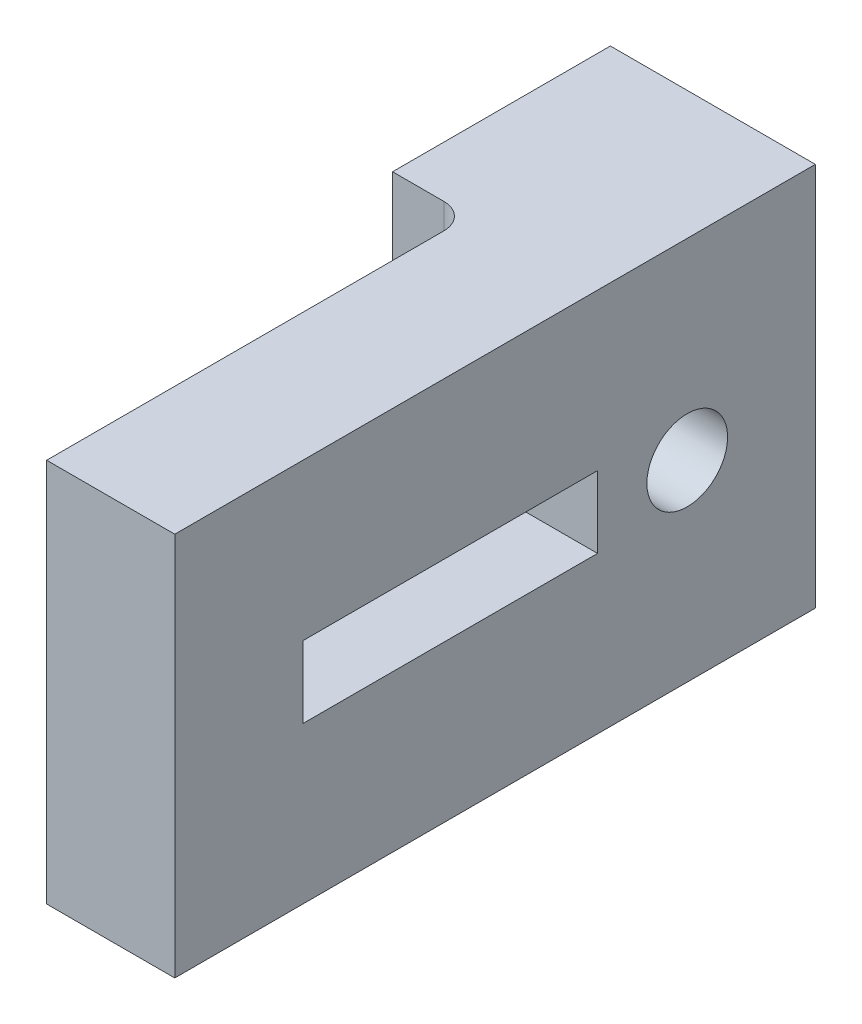
ISO-10303-21;
HEADER;
FILE_DESCRIPTION(('STEP AP214'),'2;1');
FILE_NAME('part.step','',(''),(''),'','','');
FILE_SCHEMA(('AUTOMOTIVE_DESIGN { 1 0 10303 214 1 1 1 1 }'));
ENDSEC;
DATA;
#1=APPLICATION_CONTEXT('core data for automotive mechanical design processes');
#2=APPLICATION_PROTOCOL_DEFINITION('international standard','automotive_design',2000,#1);
#3=PRODUCT_CONTEXT('',#1,'mechanical');
#4=PRODUCT('Part','Part','',(#3));
#5=PRODUCT_RELATED_PRODUCT_CATEGORY('part','',(#4));
#6=PRODUCT_DEFINITION_FORMATION('','',#4);
#7=PRODUCT_DEFINITION_CONTEXT('part definition',#1,'design');
#8=PRODUCT_DEFINITION('design','',#6,#7);
#9=PRODUCT_DEFINITION_SHAPE('','',#8);
#10=(LENGTH_UNIT() NAMED_UNIT(*) SI_UNIT(.MILLI.,.METRE.));
#11=(NAMED_UNIT(*) PLANE_ANGLE_UNIT() SI_UNIT($,.RADIAN.));
#12=(NAMED_UNIT(*) SI_UNIT($,.STERADIAN.) SOLID_ANGLE_UNIT());
#13=UNCERTAINTY_MEASURE_WITH_UNIT(LENGTH_MEASURE(1.E-05),#10,'distance_accuracy_value','');
#14=(GEOMETRIC_REPRESENTATION_CONTEXT(3) GLOBAL_UNCERTAINTY_ASSIGNED_CONTEXT((#13)) GLOBAL_UNIT_ASSIGNED_CONTEXT((#10,
#11,#12)) REPRESENTATION_CONTEXT('',''));
#15=CARTESIAN_POINT('',(0.,0.,0.));
#16=DIRECTION('',(0.,0.,1.));
#17=DIRECTION('',(1.,0.,0.));
#18=AXIS2_PLACEMENT_3D('',#15,#16,#17);
#19=CARTESIAN_POINT('',(-2.74789915966386,15.,11.9411764705882));
#20=DIRECTION('',(1.,0.,0.));
#21=DIRECTION('',(0.,0.,-1.));
#22=AXIS2_PLACEMENT_3D('',#19,#20,#21);
#23=PLANE('',#22);
#24=DIRECTION('',(0.,0.,1.));
#25=VECTOR('',#24,1.);
#26=CARTESIAN_POINT('',(-2.74789915966386,8.9,0.));
#27=LINE('',#26,#25);
#28=CARTESIAN_POINT('',(-2.74789915966386,8.9,-3.55882352941177));
#29=VERTEX_POINT('',#28);
#30=CARTESIAN_POINT('',(-2.74789915966386,8.9,6.94117647058824));
#31=VERTEX_POINT('',#30);
#32=EDGE_CURVE('E152',#29,#31,#27,.T.);
#33=ORIENTED_EDGE('',*,*,#32,.T.);
#34=DIRECTION('',(0.,-1.,0.));
#35=VECTOR('',#34,1.);
#36=CARTESIAN_POINT('',(-2.74789915966386,0.,6.94117647058824));
#37=LINE('',#36,#35);
#38=CARTESIAN_POINT('',(-2.74789915966386,6.1,6.94117647058824));
#39=VERTEX_POINT('',#38);
#40=EDGE_CURVE('E149',#31,#39,#37,.T.);
#41=ORIENTED_EDGE('',*,*,#40,.T.);
#42=DIRECTION('',(0.,0.,-1.));
#43=VECTOR('',#42,1.);
#44=CARTESIAN_POINT('',(-2.74789915966386,6.1,0.));
#45=LINE('',#44,#43);
#46=CARTESIAN_POINT('',(-2.74789915966386,6.1,-3.55882352941177));
#47=VERTEX_POINT('',#46);
#48=EDGE_CURVE('E142',#39,#47,#45,.T.);
#49=ORIENTED_EDGE('',*,*,#48,.T.);
#50=DIRECTION('',(0.,-1.,0.));
#51=VECTOR('',#50,1.);
#52=CARTESIAN_POINT('',(-2.74789915966386,0.,-3.55882352941177));
#53=LINE('',#52,#51);
#54=CARTESIAN_POINT('',(-2.74789915966386,0.,-3.55882352941177));
#55=VERTEX_POINT('',#54);
#56=EDGE_CURVE('E208',#47,#55,#53,.T.);
#57=ORIENTED_EDGE('',*,*,#56,.T.);
#58=DIRECTION('',(0.,0.,1.));
#59=VECTOR('',#58,1.);
#60=CARTESIAN_POINT('',(-2.74789915966386,0.,11.9411764705882));
#61=LINE('',#60,#59);
#62=CARTESIAN_POINT('',(-2.74789915966386,0.,11.9411764705882));
#63=VERTEX_POINT('',#62);
#64=EDGE_CURVE('E187',#55,#63,#61,.T.);
#65=ORIENTED_EDGE('',*,*,#64,.T.);
#66=DIRECTION('',(0.,-1.,0.));
#67=VECTOR('',#66,1.);
#68=CARTESIAN_POINT('',(-2.74789915966386,15.,11.9411764705882));
#69=LINE('',#68,#67);
#70=CARTESIAN_POINT('',(-2.74789915966386,15.,11.9411764705882));
#71=VERTEX_POINT('',#70);
#72=EDGE_CURVE('E202',#71,#63,#69,.T.);
#73=ORIENTED_EDGE('',*,*,#72,.F.);
#74=DIRECTION('',(0.,0.,1.));
#75=VECTOR('',#74,1.);
#76=CARTESIAN_POINT('',(-2.74789915966386,15.,11.9411764705882));
#77=LINE('',#76,#75);
#78=CARTESIAN_POINT('',(-2.74789915966386,15.,-3.55882352941177));
#79=VERTEX_POINT('',#78);
#80=EDGE_CURVE('E172',#79,#71,#77,.T.);
#81=ORIENTED_EDGE('',*,*,#80,.F.);
#82=EDGE_CURVE('E211',#79,#29,#53,.T.);
#83=ORIENTED_EDGE('',*,*,#82,.T.);
#84=EDGE_LOOP('',(#33,#41,#49,#57,#65,#73,#81,#83));
#85=FACE_BOUND('',#84,.T.);
#86=ADVANCED_FACE('F39',(#85),#23,.F.);
#87=CARTESIAN_POINT('',(2.25210084033614,15.,-13.0588235294118));
#88=DIRECTION('',(-1.,0.,0.));
#89=DIRECTION('',(0.,0.,1.));
#90=AXIS2_PLACEMENT_3D('',#87,#88,#89);
#91=PLANE('',#90);
#92=DIRECTION('',(0.,0.,-1.));
#93=VECTOR('',#92,1.);
#94=CARTESIAN_POINT('',(2.25210084033614,0.,-13.0588235294118));
#95=LINE('',#94,#93);
#96=CARTESIAN_POINT('',(2.25210084033614,0.,11.9411764705882));
#97=VERTEX_POINT('',#96);
#98=CARTESIAN_POINT('',(2.25210084033614,0.,-13.0588235294118));
#99=VERTEX_POINT('',#98);
#100=EDGE_CURVE('E191',#97,#99,#95,.T.);
#101=ORIENTED_EDGE('',*,*,#100,.T.);
#102=DIRECTION('',(0.,-1.,0.));
#103=VECTOR('',#102,1.);
#104=CARTESIAN_POINT('',(2.25210084033614,15.,-13.0588235294118));
#105=LINE('',#104,#103);
#106=CARTESIAN_POINT('',(2.25210084033614,15.,-13.0588235294118));
#107=VERTEX_POINT('',#106);
#108=EDGE_CURVE('E196',#107,#99,#105,.T.);
#109=ORIENTED_EDGE('',*,*,#108,.F.);
#110=DIRECTION('',(0.,0.,-1.));
#111=VECTOR('',#110,1.);
#112=CARTESIAN_POINT('',(2.25210084033614,15.,-13.0588235294118));
#113=LINE('',#112,#111);
#114=CARTESIAN_POINT('',(2.25210084033614,15.,11.9411764705882));
#115=VERTEX_POINT('',#114);
#116=EDGE_CURVE('E176',#115,#107,#113,.T.);
#117=ORIENTED_EDGE('',*,*,#116,.F.);
#118=DIRECTION('',(0.,-1.,0.));
#119=VECTOR('',#118,1.);
#120=CARTESIAN_POINT('',(2.25210084033614,15.,11.9411764705882));
#121=LINE('',#120,#119);
#122=EDGE_CURVE('E199',#115,#97,#121,.T.);
#123=ORIENTED_EDGE('',*,*,#122,.T.);
#124=EDGE_LOOP('',(#101,#109,#117,#123));
#125=FACE_BOUND('',#124,.T.);
#126=CARTESIAN_POINT('',(2.25210084033614,7.5,-8.05882352941177));
#127=DIRECTION('',(-1.,0.,0.));
#128=DIRECTION('',(0.,0.,1.));
#129=AXIS2_PLACEMENT_3D('',#126,#127,#128);
#130=CIRCLE('',#129,1.575);
#131=CARTESIAN_POINT('',(2.25210084033614,7.5,-6.48382352941177));
#132=VERTEX_POINT('',#131);
#133=EDGE_CURVE('E164',#132,#132,#130,.T.);
#134=ORIENTED_EDGE('',*,*,#133,.T.);
#135=EDGE_LOOP('',(#134));
#136=FACE_BOUND('',#135,.T.);
#137=DIRECTION('',(0.,1.,0.));
#138=VECTOR('',#137,1.);
#139=CARTESIAN_POINT('',(2.25210084033614,15.,-4.55882352941177));
#140=LINE('',#139,#138);
#141=CARTESIAN_POINT('',(2.25210084033614,6.1,-4.55882352941177));
#142=VERTEX_POINT('',#141);
#143=CARTESIAN_POINT('',(2.25210084033614,8.9,-4.55882352941177));
#144=VERTEX_POINT('',#143);
#145=EDGE_CURVE('E11',#142,#144,#140,.T.);
#146=ORIENTED_EDGE('',*,*,#145,.F.);
#147=DIRECTION('',(0.,0.,-1.));
#148=VECTOR('',#147,1.);
#149=CARTESIAN_POINT('',(2.25210084033614,6.1,-13.0588235294118));
#150=LINE('',#149,#148);
#151=CARTESIAN_POINT('',(2.25210084033614,6.1,6.94117647058823));
#152=VERTEX_POINT('',#151);
#153=EDGE_CURVE('E133',#152,#142,#150,.T.);
#154=ORIENTED_EDGE('',*,*,#153,.F.);
#155=DIRECTION('',(0.,-1.,0.));
#156=VECTOR('',#155,1.);
#157=CARTESIAN_POINT('',(2.25210084033614,15.,6.94117647058824));
#158=LINE('',#157,#156);
#159=CARTESIAN_POINT('',(2.25210084033614,8.9,6.94117647058824));
#160=VERTEX_POINT('',#159);
#161=EDGE_CURVE('E47',#160,#152,#158,.T.);
#162=ORIENTED_EDGE('',*,*,#161,.F.);
#163=DIRECTION('',(0.,0.,1.));
#164=VECTOR('',#163,1.);
#165=CARTESIAN_POINT('',(2.25210084033614,8.9,-13.0588235294118));
#166=LINE('',#165,#164);
#167=EDGE_CURVE('E159',#144,#160,#166,.T.);
#168=ORIENTED_EDGE('',*,*,#167,.F.);
#169=EDGE_LOOP('',(#146,#154,#162,#168));
#170=FACE_BOUND('',#169,.T.);
#171=ADVANCED_FACE('F226',(#125,#136,#170),#91,.F.);
#172=CARTESIAN_POINT('',(-5.74789915966386,15.,-4.55882352941177));
#173=DIRECTION('',(1.,0.,0.));
#174=DIRECTION('',(0.,0.,-1.));
#175=AXIS2_PLACEMENT_3D('',#172,#173,#174);
#176=PLANE('',#175);
#177=CARTESIAN_POINT('',(-5.74789915966386,7.5,-8.05882352941177));
#178=DIRECTION('',(-1.,0.,0.));
#179=DIRECTION('',(0.,0.,1.));
#180=AXIS2_PLACEMENT_3D('',#177,#178,#179);
#181=CIRCLE('',#180,1.575);
#182=CARTESIAN_POINT('',(-5.74789915966386,7.5,-6.48382352941177));
#183=VERTEX_POINT('',#182);
#184=EDGE_CURVE('E161',#183,#183,#181,.T.);
#185=ORIENTED_EDGE('',*,*,#184,.F.);
#186=EDGE_LOOP('',(#185));
#187=FACE_BOUND('',#186,.T.);
#188=DIRECTION('',(0.,0.,1.));
#189=VECTOR('',#188,1.);
#190=CARTESIAN_POINT('',(-5.74789915966386,0.,-4.55882352941177));
#191=LINE('',#190,#189);
#192=CARTESIAN_POINT('',(-5.74789915966386,0.,-13.0588235294118));
#193=VERTEX_POINT('',#192);
#194=CARTESIAN_POINT('',(-5.74789915966386,0.,-4.55882352941177));
#195=VERTEX_POINT('',#194);
#196=EDGE_CURVE('E181',#193,#195,#191,.T.);
#197=ORIENTED_EDGE('',*,*,#196,.T.);
#198=DIRECTION('',(0.,-1.,0.));
#199=VECTOR('',#198,1.);
#200=CARTESIAN_POINT('',(-5.74789915966386,15.,-4.55882352941177));
#201=LINE('',#200,#199);
#202=CARTESIAN_POINT('',(-5.74789915966386,15.,-4.55882352941177));
#203=VERTEX_POINT('',#202);
#204=EDGE_CURVE('E205',#203,#195,#201,.T.);
#205=ORIENTED_EDGE('',*,*,#204,.F.);
#206=DIRECTION('',(0.,0.,1.));
#207=VECTOR('',#206,1.);
#208=CARTESIAN_POINT('',(-5.74789915966386,15.,-4.55882352941177));
#209=LINE('',#208,#207);
#210=CARTESIAN_POINT('',(-5.74789915966386,15.,-13.0588235294118));
#211=VERTEX_POINT('',#210);
#212=EDGE_CURVE('E165',#211,#203,#209,.T.);
#213=ORIENTED_EDGE('',*,*,#212,.F.);
#214=DIRECTION('',(0.,-1.,0.));
#215=VECTOR('',#214,1.);
#216=CARTESIAN_POINT('',(-5.74789915966386,15.,-13.0588235294118));
#217=LINE('',#216,#215);
#218=EDGE_CURVE('E180',#211,#193,#217,.T.);
#219=ORIENTED_EDGE('',*,*,#218,.T.);
#220=EDGE_LOOP('',(#197,#205,#213,#219));
#221=FACE_BOUND('',#220,.T.);
#222=ADVANCED_FACE('F265',(#187,#221),#176,.F.);
#223=CARTESIAN_POINT('',(-2.74789915966386,15.,-4.55882352941177));
#224=DIRECTION('',(0.,0.,-1.));
#225=DIRECTION('',(-1.,0.,0.));
#226=AXIS2_PLACEMENT_3D('',#223,#224,#225);
#227=PLANE('',#226);
#228=DIRECTION('',(1.,0.,0.));
#229=VECTOR('',#228,1.);
#230=CARTESIAN_POINT('',(-2.74789915966386,0.,-4.55882352941177));
#231=LINE('',#230,#229);
#232=CARTESIAN_POINT('',(-3.74789915966386,0.,-4.55882352941177));
#233=VERTEX_POINT('',#232);
#234=EDGE_CURVE('E184',#195,#233,#231,.T.);
#235=ORIENTED_EDGE('',*,*,#234,.T.);
#236=DIRECTION('',(0.,-1.,0.));
#237=VECTOR('',#236,1.);
#238=CARTESIAN_POINT('',(-3.74789915966386,15.,-4.55882352941177));
#239=LINE('',#238,#237);
#240=CARTESIAN_POINT('',(-3.74789915966386,15.,-4.55882352941177));
#241=VERTEX_POINT('',#240);
#242=EDGE_CURVE('E214',#233,#241,#239,.F.);
#243=ORIENTED_EDGE('',*,*,#242,.T.);
#244=DIRECTION('',(1.,0.,0.));
#245=VECTOR('',#244,1.);
#246=CARTESIAN_POINT('',(-2.74789915966386,15.,-4.55882352941177));
#247=LINE('',#246,#245);
#248=EDGE_CURVE('E168',#203,#241,#247,.T.);
#249=ORIENTED_EDGE('',*,*,#248,.F.);
#250=ORIENTED_EDGE('',*,*,#204,.T.);
#251=EDGE_LOOP('',(#235,#243,#249,#250));
#252=FACE_BOUND('',#251,.T.);
#253=ADVANCED_FACE('F245',(#252),#227,.F.);
#254=CARTESIAN_POINT('',(2.25210084033614,15.,11.9411764705882));
#255=DIRECTION('',(0.,0.,-1.));
#256=DIRECTION('',(-1.,0.,0.));
#257=AXIS2_PLACEMENT_3D('',#254,#255,#256);
#258=PLANE('',#257);
#259=DIRECTION('',(1.,0.,0.));
#260=VECTOR('',#259,1.);
#261=CARTESIAN_POINT('',(2.25210084033614,0.,11.9411764705882));
#262=LINE('',#261,#260);
#263=EDGE_CURVE('E189',#63,#97,#262,.T.);
#264=ORIENTED_EDGE('',*,*,#263,.T.);
#265=ORIENTED_EDGE('',*,*,#122,.F.);
#266=DIRECTION('',(1.,0.,0.));
#267=VECTOR('',#266,1.);
#268=CARTESIAN_POINT('',(2.25210084033614,15.,11.9411764705882));
#269=LINE('',#268,#267);
#270=EDGE_CURVE('E174',#71,#115,#269,.T.);
#271=ORIENTED_EDGE('',*,*,#270,.F.);
#272=ORIENTED_EDGE('',*,*,#72,.T.);
#273=EDGE_LOOP('',(#264,#265,#271,#272));
#274=FACE_BOUND('',#273,.T.);
#275=ADVANCED_FACE('F254',(#274),#258,.F.);
#276=CARTESIAN_POINT('',(-5.74789915966386,15.,-13.0588235294118));
#277=DIRECTION('',(0.,0.,1.));
#278=DIRECTION('',(1.,0.,0.));
#279=AXIS2_PLACEMENT_3D('',#276,#277,#278);
#280=PLANE('',#279);
#281=DIRECTION('',(-1.,0.,0.));
#282=VECTOR('',#281,1.);
#283=CARTESIAN_POINT('',(-5.74789915966386,0.,-13.0588235294118));
#284=LINE('',#283,#282);
#285=EDGE_CURVE('E169',#99,#193,#284,.T.);
#286=ORIENTED_EDGE('',*,*,#285,.T.);
#287=ORIENTED_EDGE('',*,*,#218,.F.);
#288=DIRECTION('',(-1.,0.,0.));
#289=VECTOR('',#288,1.);
#290=CARTESIAN_POINT('',(-5.74789915966386,15.,-13.0588235294118));
#291=LINE('',#290,#289);
#292=EDGE_CURVE('E178',#107,#211,#291,.T.);
#293=ORIENTED_EDGE('',*,*,#292,.F.);
#294=ORIENTED_EDGE('',*,*,#108,.T.);
#295=EDGE_LOOP('',(#286,#287,#293,#294));
#296=FACE_BOUND('',#295,.T.);
#297=ADVANCED_FACE('F263',(#296),#280,.F.);
#298=CARTESIAN_POINT('',(0.,15.,0.));
#299=DIRECTION('',(0.,-1.,0.));
#300=DIRECTION('',(0.,0.,-1.));
#301=AXIS2_PLACEMENT_3D('',#298,#299,#300);
#302=PLANE('',#301);
#303=ORIENTED_EDGE('',*,*,#212,.T.);
#304=ORIENTED_EDGE('',*,*,#248,.T.);
#305=CARTESIAN_POINT('',(-3.74789915966386,15.,-3.55882352941177));
#306=DIRECTION('',(0.,-1.,0.));
#307=DIRECTION('',(0.,0.,-1.));
#308=AXIS2_PLACEMENT_3D('',#305,#306,#307);
#309=CIRCLE('',#308,1.);
#310=EDGE_CURVE('E218',#241,#79,#309,.T.);
#311=ORIENTED_EDGE('',*,*,#310,.T.);
#312=ORIENTED_EDGE('',*,*,#80,.T.);
#313=ORIENTED_EDGE('',*,*,#270,.T.);
#314=ORIENTED_EDGE('',*,*,#116,.T.);
#315=ORIENTED_EDGE('',*,*,#292,.T.);
#316=EDGE_LOOP('',(#303,#304,#311,#312,#313,#314,#315));
#317=FACE_BOUND('',#316,.T.);
#318=ADVANCED_FACE('F240',(#317),#302,.F.);
#319=CARTESIAN_POINT('',(0.,0.,0.));
#320=DIRECTION('',(0.,-1.,0.));
#321=DIRECTION('',(0.,0.,-1.));
#322=AXIS2_PLACEMENT_3D('',#319,#320,#321);
#323=PLANE('',#322);
#324=ORIENTED_EDGE('',*,*,#196,.F.);
#325=ORIENTED_EDGE('',*,*,#285,.F.);
#326=ORIENTED_EDGE('',*,*,#100,.F.);
#327=ORIENTED_EDGE('',*,*,#263,.F.);
#328=ORIENTED_EDGE('',*,*,#64,.F.);
#329=CARTESIAN_POINT('',(-3.74789915966386,0.,-3.55882352941177));
#330=DIRECTION('',(0.,-1.,0.));
#331=DIRECTION('',(0.,0.,-1.));
#332=AXIS2_PLACEMENT_3D('',#329,#330,#331);
#333=CIRCLE('',#332,1.);
#334=EDGE_CURVE('E216',#55,#233,#333,.F.);
#335=ORIENTED_EDGE('',*,*,#334,.T.);
#336=ORIENTED_EDGE('',*,*,#234,.F.);
#337=EDGE_LOOP('',(#324,#325,#326,#327,#328,#335,#336));
#338=FACE_BOUND('',#337,.T.);
#339=ADVANCED_FACE('F249',(#338),#323,.T.);
#340=CARTESIAN_POINT('',(9.25210084033614,7.5,-8.05882352941177));
#341=DIRECTION('',(-1.,0.,0.));
#342=DIRECTION('',(0.,0.,1.));
#343=AXIS2_PLACEMENT_3D('',#340,#341,#342);
#344=CYLINDRICAL_SURFACE('',#343,1.575);
#345=ORIENTED_EDGE('',*,*,#184,.T.);
#346=EDGE_LOOP('',(#345));
#347=FACE_BOUND('',#346,.T.);
#348=ORIENTED_EDGE('',*,*,#133,.F.);
#349=EDGE_LOOP('',(#348));
#350=FACE_BOUND('',#349,.T.);
#351=ADVANCED_FACE('F286',(#347,#350),#344,.F.);
#352=CARTESIAN_POINT('',(-3.74789915966386,15.,-3.55882352941177));
#353=DIRECTION('',(0.,1.,0.));
#354=DIRECTION('',(0.,0.,1.));
#355=AXIS2_PLACEMENT_3D('',#352,#353,#354);
#356=CYLINDRICAL_SURFACE('',#355,1.);
#357=ORIENTED_EDGE('',*,*,#310,.F.);
#358=ORIENTED_EDGE('',*,*,#242,.F.);
#359=ORIENTED_EDGE('',*,*,#334,.F.);
#360=ORIENTED_EDGE('',*,*,#56,.F.);
#361=EDGE_CURVE('E141',#29,#47,#53,.T.);
#362=ORIENTED_EDGE('',*,*,#361,.F.);
#363=ORIENTED_EDGE('',*,*,#82,.F.);
#364=EDGE_LOOP('',(#357,#358,#359,#360,#362,#363));
#365=FACE_BOUND('',#364,.T.);
#366=ADVANCED_FACE('F41',(#365),#356,.F.);
#367=CARTESIAN_POINT('',(7.25210084033614,0.,-4.55882352941177));
#368=DIRECTION('',(0.,0.,1.));
#369=DIRECTION('',(1.,0.,0.));
#370=AXIS2_PLACEMENT_3D('',#367,#368,#369);
#371=PLANE('',#370);
#372=ORIENTED_EDGE('',*,*,#145,.T.);
#373=DIRECTION('',(-1.,0.,0.));
#374=VECTOR('',#373,1.);
#375=CARTESIAN_POINT('',(7.25210084033614,8.9,-4.55882352941177));
#376=LINE('',#375,#374);
#377=CARTESIAN_POINT('',(-2.74789915966386,8.9,-4.55882352941177));
#378=VERTEX_POINT('',#377);
#379=EDGE_CURVE('E146',#144,#378,#376,.T.);
#380=ORIENTED_EDGE('',*,*,#379,.T.);
#381=DIRECTION('',(0.,1.,0.));
#382=VECTOR('',#381,1.);
#383=CARTESIAN_POINT('',(-2.74789915966386,0.,-4.55882352941177));
#384=LINE('',#383,#382);
#385=CARTESIAN_POINT('',(-2.74789915966386,6.1,-4.55882352941177));
#386=VERTEX_POINT('',#385);
#387=EDGE_CURVE('E139',#386,#378,#384,.T.);
#388=ORIENTED_EDGE('',*,*,#387,.F.);
#389=DIRECTION('',(-1.,0.,0.));
#390=VECTOR('',#389,1.);
#391=CARTESIAN_POINT('',(7.25210084033614,6.1,-4.55882352941177));
#392=LINE('',#391,#390);
#393=EDGE_CURVE('E127',#142,#386,#392,.T.);
#394=ORIENTED_EDGE('',*,*,#393,.F.);
#395=EDGE_LOOP('',(#372,#380,#388,#394));
#396=FACE_BOUND('',#395,.T.);
#397=ADVANCED_FACE('F144',(#396),#371,.T.);
#398=CARTESIAN_POINT('',(7.25210084033614,0.,6.94117647058824));
#399=DIRECTION('',(0.,0.,-1.));
#400=DIRECTION('',(-1.,0.,0.));
#401=AXIS2_PLACEMENT_3D('',#398,#399,#400);
#402=PLANE('',#401);
#403=ORIENTED_EDGE('',*,*,#161,.T.);
#404=DIRECTION('',(-1.,0.,0.));
#405=VECTOR('',#404,1.);
#406=CARTESIAN_POINT('',(7.25210084033614,6.1,6.94117647058824));
#407=LINE('',#406,#405);
#408=EDGE_CURVE('E54',#152,#39,#407,.T.);
#409=ORIENTED_EDGE('',*,*,#408,.T.);
#410=ORIENTED_EDGE('',*,*,#40,.F.);
#411=DIRECTION('',(-1.,0.,0.));
#412=VECTOR('',#411,1.);
#413=CARTESIAN_POINT('',(7.25210084033614,8.9,6.94117647058824));
#414=LINE('',#413,#412);
#415=EDGE_CURVE('E155',#160,#31,#414,.T.);
#416=ORIENTED_EDGE('',*,*,#415,.F.);
#417=EDGE_LOOP('',(#403,#409,#410,#416));
#418=FACE_BOUND('',#417,.T.);
#419=ADVANCED_FACE('F222',(#418),#402,.T.);
#420=CARTESIAN_POINT('',(7.25210084033614,8.9,0.));
#421=DIRECTION('',(0.,-1.,0.));
#422=DIRECTION('',(0.,0.,-1.));
#423=AXIS2_PLACEMENT_3D('',#420,#421,#422);
#424=PLANE('',#423);
#425=ORIENTED_EDGE('',*,*,#167,.T.);
#426=ORIENTED_EDGE('',*,*,#415,.T.);
#427=ORIENTED_EDGE('',*,*,#32,.F.);
#428=EDGE_CURVE('E62',#378,#29,#27,.T.);
#429=ORIENTED_EDGE('',*,*,#428,.F.);
#430=ORIENTED_EDGE('',*,*,#379,.F.);
#431=EDGE_LOOP('',(#425,#426,#427,#429,#430));
#432=FACE_BOUND('',#431,.T.);
#433=ADVANCED_FACE('F228',(#432),#424,.T.);
#434=CARTESIAN_POINT('',(7.25210084033614,6.1,0.));
#435=DIRECTION('',(0.,1.,0.));
#436=DIRECTION('',(0.,0.,1.));
#437=AXIS2_PLACEMENT_3D('',#434,#435,#436);
#438=PLANE('',#437);
#439=ORIENTED_EDGE('',*,*,#153,.T.);
#440=ORIENTED_EDGE('',*,*,#393,.T.);
#441=EDGE_CURVE('E130',#47,#386,#45,.T.);
#442=ORIENTED_EDGE('',*,*,#441,.F.);
#443=ORIENTED_EDGE('',*,*,#48,.F.);
#444=ORIENTED_EDGE('',*,*,#408,.F.);
#445=EDGE_LOOP('',(#439,#440,#442,#443,#444));
#446=FACE_BOUND('',#445,.T.);
#447=ADVANCED_FACE('F129',(#446),#438,.T.);
#448=CARTESIAN_POINT('',(-2.74789915966386,0.,0.));
#449=DIRECTION('',(-1.,0.,0.));
#450=DIRECTION('',(0.,0.,1.));
#451=AXIS2_PLACEMENT_3D('',#448,#449,#450);
#452=PLANE('',#451);
#453=ORIENTED_EDGE('',*,*,#361,.T.);
#454=ORIENTED_EDGE('',*,*,#441,.T.);
#455=ORIENTED_EDGE('',*,*,#387,.T.);
#456=ORIENTED_EDGE('',*,*,#428,.T.);
#457=EDGE_LOOP('',(#453,#454,#455,#456));
#458=FACE_BOUND('',#457,.T.);
#459=ADVANCED_FACE('F138',(#458),#452,.F.);
#460=CLOSED_SHELL('',(#86,#171,#222,#253,#275,#297,#318,#339,#351,#366,#397,#419,#433,#447,#459));
#461=MANIFOLD_SOLID_BREP('B2',#460);
#462=ADVANCED_BREP_SHAPE_REPRESENTATION('',(#18,#461),#14);
#463=SHAPE_DEFINITION_REPRESENTATION(#9,#462);
ENDSEC;
END-ISO-10303-21;
